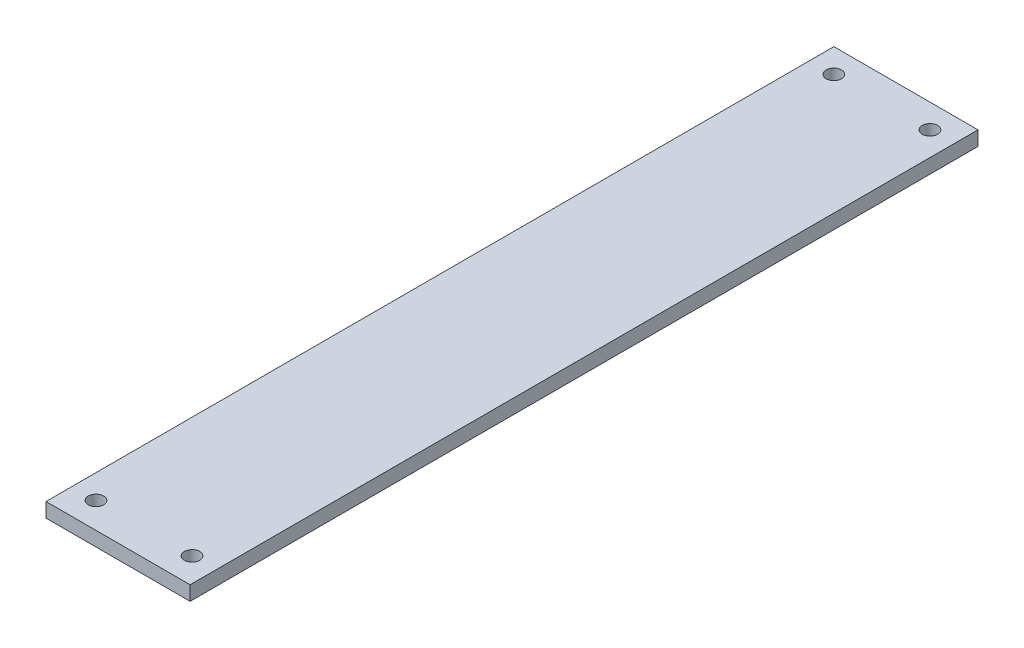
ISO-10303-21;
HEADER;
FILE_DESCRIPTION(('STEP AP214'),'2;1');
FILE_NAME('part.step','',(''),(''),'','','');
FILE_SCHEMA(('AUTOMOTIVE_DESIGN { 1 0 10303 214 1 1 1 1 }'));
ENDSEC;
DATA;
#1=APPLICATION_CONTEXT('core data for automotive mechanical design processes');
#2=APPLICATION_PROTOCOL_DEFINITION('international standard','automotive_design',2000,#1);
#3=PRODUCT_CONTEXT('',#1,'mechanical');
#4=PRODUCT('Part','Part','',(#3));
#5=PRODUCT_RELATED_PRODUCT_CATEGORY('part','',(#4));
#6=PRODUCT_DEFINITION_FORMATION('','',#4);
#7=PRODUCT_DEFINITION_CONTEXT('part definition',#1,'design');
#8=PRODUCT_DEFINITION('design','',#6,#7);
#9=PRODUCT_DEFINITION_SHAPE('','',#8);
#10=(LENGTH_UNIT() NAMED_UNIT(*) SI_UNIT(.MILLI.,.METRE.));
#11=(NAMED_UNIT(*) PLANE_ANGLE_UNIT() SI_UNIT($,.RADIAN.));
#12=(NAMED_UNIT(*) SI_UNIT($,.STERADIAN.) SOLID_ANGLE_UNIT());
#13=UNCERTAINTY_MEASURE_WITH_UNIT(LENGTH_MEASURE(1.E-05),#10,'distance_accuracy_value','');
#14=(GEOMETRIC_REPRESENTATION_CONTEXT(3) GLOBAL_UNCERTAINTY_ASSIGNED_CONTEXT((#13)) GLOBAL_UNIT_ASSIGNED_CONTEXT((#10,
#11,#12)) REPRESENTATION_CONTEXT('',''));
#15=CARTESIAN_POINT('',(0.,0.,0.));
#16=DIRECTION('',(0.,0.,1.));
#17=DIRECTION('',(1.,0.,0.));
#18=AXIS2_PLACEMENT_3D('',#15,#16,#17);
#19=CARTESIAN_POINT('',(0.,3.,0.));
#20=DIRECTION('',(1.,0.,0.));
#21=DIRECTION('',(0.,0.,-1.));
#22=AXIS2_PLACEMENT_3D('',#19,#20,#21);
#23=PLANE('',#22);
#24=DIRECTION('',(0.,0.,1.));
#25=VECTOR('',#24,1.);
#26=CARTESIAN_POINT('',(0.,0.,0.));
#27=LINE('',#26,#25);
#28=CARTESIAN_POINT('',(0.,0.,-164.));
#29=VERTEX_POINT('',#28);
#30=CARTESIAN_POINT('',(0.,0.,0.));
#31=VERTEX_POINT('',#30);
#32=EDGE_CURVE('E98',#29,#31,#27,.T.);
#33=ORIENTED_EDGE('',*,*,#32,.T.);
#34=DIRECTION('',(0.,-1.,0.));
#35=VECTOR('',#34,1.);
#36=CARTESIAN_POINT('',(0.,3.,0.));
#37=LINE('',#36,#35);
#38=CARTESIAN_POINT('',(0.,3.,0.));
#39=VERTEX_POINT('',#38);
#40=EDGE_CURVE('E11',#39,#31,#37,.T.);
#41=ORIENTED_EDGE('',*,*,#40,.F.);
#42=DIRECTION('',(0.,0.,1.));
#43=VECTOR('',#42,1.);
#44=CARTESIAN_POINT('',(0.,3.,0.));
#45=LINE('',#44,#43);
#46=CARTESIAN_POINT('',(0.,3.,-164.));
#47=VERTEX_POINT('',#46);
#48=EDGE_CURVE('E85',#47,#39,#45,.T.);
#49=ORIENTED_EDGE('',*,*,#48,.F.);
#50=DIRECTION('',(0.,-1.,0.));
#51=VECTOR('',#50,1.);
#52=CARTESIAN_POINT('',(0.,3.,-164.));
#53=LINE('',#52,#51);
#54=EDGE_CURVE('E94',#47,#29,#53,.T.);
#55=ORIENTED_EDGE('',*,*,#54,.T.);
#56=EDGE_LOOP('',(#33,#41,#49,#55));
#57=FACE_BOUND('',#56,.T.);
#58=ADVANCED_FACE('F32',(#57),#23,.F.);
#59=CARTESIAN_POINT('',(0.,3.,0.));
#60=DIRECTION('',(0.,0.,-1.));
#61=DIRECTION('',(-1.,0.,0.));
#62=AXIS2_PLACEMENT_3D('',#59,#60,#61);
#63=PLANE('',#62);
#64=DIRECTION('',(1.,0.,0.));
#65=VECTOR('',#64,1.);
#66=CARTESIAN_POINT('',(0.,0.,0.));
#67=LINE('',#66,#65);
#68=CARTESIAN_POINT('',(30.,0.,0.));
#69=VERTEX_POINT('',#68);
#70=EDGE_CURVE('E89',#31,#69,#67,.T.);
#71=ORIENTED_EDGE('',*,*,#70,.T.);
#72=DIRECTION('',(0.,-1.,0.));
#73=VECTOR('',#72,1.);
#74=CARTESIAN_POINT('',(30.,3.,0.));
#75=LINE('',#74,#73);
#76=CARTESIAN_POINT('',(30.,3.,0.));
#77=VERTEX_POINT('',#76);
#78=EDGE_CURVE('E41',#77,#69,#75,.T.);
#79=ORIENTED_EDGE('',*,*,#78,.F.);
#80=DIRECTION('',(1.,0.,0.));
#81=VECTOR('',#80,1.);
#82=CARTESIAN_POINT('',(0.,3.,0.));
#83=LINE('',#82,#81);
#84=EDGE_CURVE('E80',#39,#77,#83,.T.);
#85=ORIENTED_EDGE('',*,*,#84,.F.);
#86=ORIENTED_EDGE('',*,*,#40,.T.);
#87=EDGE_LOOP('',(#71,#79,#85,#86));
#88=FACE_BOUND('',#87,.T.);
#89=ADVANCED_FACE('F88',(#88),#63,.F.);
#90=CARTESIAN_POINT('',(30.,3.,0.));
#91=DIRECTION('',(-1.,0.,0.));
#92=DIRECTION('',(0.,0.,1.));
#93=AXIS2_PLACEMENT_3D('',#90,#91,#92);
#94=PLANE('',#93);
#95=DIRECTION('',(0.,0.,-1.));
#96=VECTOR('',#95,1.);
#97=CARTESIAN_POINT('',(30.,0.,0.));
#98=LINE('',#97,#96);
#99=CARTESIAN_POINT('',(30.,0.,-164.));
#100=VERTEX_POINT('',#99);
#101=EDGE_CURVE('E67',#69,#100,#98,.T.);
#102=ORIENTED_EDGE('',*,*,#101,.T.);
#103=DIRECTION('',(0.,-1.,0.));
#104=VECTOR('',#103,1.);
#105=CARTESIAN_POINT('',(30.,3.,-164.));
#106=LINE('',#105,#104);
#107=CARTESIAN_POINT('',(30.,3.,-164.));
#108=VERTEX_POINT('',#107);
#109=EDGE_CURVE('E90',#108,#100,#106,.T.);
#110=ORIENTED_EDGE('',*,*,#109,.F.);
#111=DIRECTION('',(0.,0.,-1.));
#112=VECTOR('',#111,1.);
#113=CARTESIAN_POINT('',(30.,3.,0.));
#114=LINE('',#113,#112);
#115=EDGE_CURVE('E83',#77,#108,#114,.T.);
#116=ORIENTED_EDGE('',*,*,#115,.F.);
#117=ORIENTED_EDGE('',*,*,#78,.T.);
#118=EDGE_LOOP('',(#102,#110,#116,#117));
#119=FACE_BOUND('',#118,.T.);
#120=ADVANCED_FACE('F92',(#119),#94,.F.);
#121=CARTESIAN_POINT('',(0.,3.,-164.));
#122=DIRECTION('',(0.,0.,1.));
#123=DIRECTION('',(1.,0.,0.));
#124=AXIS2_PLACEMENT_3D('',#121,#122,#123);
#125=PLANE('',#124);
#126=DIRECTION('',(-1.,0.,0.));
#127=VECTOR('',#126,1.);
#128=CARTESIAN_POINT('',(0.,0.,-164.));
#129=LINE('',#128,#127);
#130=EDGE_CURVE('E73',#100,#29,#129,.T.);
#131=ORIENTED_EDGE('',*,*,#130,.T.);
#132=ORIENTED_EDGE('',*,*,#54,.F.);
#133=DIRECTION('',(-1.,0.,0.));
#134=VECTOR('',#133,1.);
#135=CARTESIAN_POINT('',(0.,3.,-164.));
#136=LINE('',#135,#134);
#137=EDGE_CURVE('E50',#108,#47,#136,.T.);
#138=ORIENTED_EDGE('',*,*,#137,.F.);
#139=ORIENTED_EDGE('',*,*,#109,.T.);
#140=EDGE_LOOP('',(#131,#132,#138,#139));
#141=FACE_BOUND('',#140,.T.);
#142=ADVANCED_FACE('F134',(#141),#125,.F.);
#143=CARTESIAN_POINT('',(0.,3.,0.));
#144=DIRECTION('',(0.,-1.,0.));
#145=DIRECTION('',(0.,0.,-1.));
#146=AXIS2_PLACEMENT_3D('',#143,#144,#145);
#147=PLANE('',#146);
#148=CARTESIAN_POINT('',(25.,3.,-5.40000000000002));
#149=DIRECTION('',(0.,1.,0.));
#150=DIRECTION('',(0.,0.,1.));
#151=AXIS2_PLACEMENT_3D('',#148,#149,#150);
#152=CIRCLE('',#151,1.6);
#153=CARTESIAN_POINT('',(25.,3.,-3.80000000000001));
#154=VERTEX_POINT('',#153);
#155=EDGE_CURVE('E215',#154,#154,#152,.T.);
#156=ORIENTED_EDGE('',*,*,#155,.F.);
#157=EDGE_LOOP('',(#156));
#158=FACE_BOUND('',#157,.T.);
#159=CARTESIAN_POINT('',(5.,3.,-159.));
#160=DIRECTION('',(0.,1.,0.));
#161=DIRECTION('',(0.,0.,1.));
#162=AXIS2_PLACEMENT_3D('',#159,#160,#161);
#163=CIRCLE('',#162,1.59999999999999);
#164=CARTESIAN_POINT('',(5.,3.,-157.4));
#165=VERTEX_POINT('',#164);
#166=EDGE_CURVE('E213',#165,#165,#163,.T.);
#167=ORIENTED_EDGE('',*,*,#166,.F.);
#168=EDGE_LOOP('',(#167));
#169=FACE_BOUND('',#168,.T.);
#170=CARTESIAN_POINT('',(4.99999999999997,3.,-5.40000000000002));
#171=DIRECTION('',(0.,1.,0.));
#172=DIRECTION('',(0.,0.,1.));
#173=AXIS2_PLACEMENT_3D('',#170,#171,#172);
#174=CIRCLE('',#173,1.6);
#175=CARTESIAN_POINT('',(4.99999999999997,3.,-3.80000000000002));
#176=VERTEX_POINT('',#175);
#177=EDGE_CURVE('E216',#176,#176,#174,.T.);
#178=ORIENTED_EDGE('',*,*,#177,.F.);
#179=EDGE_LOOP('',(#178));
#180=FACE_BOUND('',#179,.T.);
#181=CARTESIAN_POINT('',(25.,3.,-159.));
#182=DIRECTION('',(0.,1.,0.));
#183=DIRECTION('',(0.,0.,1.));
#184=AXIS2_PLACEMENT_3D('',#181,#182,#183);
#185=CIRCLE('',#184,1.59999999999999);
#186=CARTESIAN_POINT('',(25.,3.,-157.4));
#187=VERTEX_POINT('',#186);
#188=EDGE_CURVE('E110',#187,#187,#185,.T.);
#189=ORIENTED_EDGE('',*,*,#188,.F.);
#190=EDGE_LOOP('',(#189));
#191=FACE_BOUND('',#190,.T.);
#192=ORIENTED_EDGE('',*,*,#48,.T.);
#193=ORIENTED_EDGE('',*,*,#84,.T.);
#194=ORIENTED_EDGE('',*,*,#115,.T.);
#195=ORIENTED_EDGE('',*,*,#137,.T.);
#196=EDGE_LOOP('',(#192,#193,#194,#195));
#197=FACE_BOUND('',#196,.T.);
#198=ADVANCED_FACE('F81',(#158,#169,#180,#191,#197),#147,.F.);
#199=CARTESIAN_POINT('',(0.,0.,0.));
#200=DIRECTION('',(0.,-1.,0.));
#201=DIRECTION('',(0.,0.,-1.));
#202=AXIS2_PLACEMENT_3D('',#199,#200,#201);
#203=PLANE('',#202);
#204=CARTESIAN_POINT('',(25.,0.,-5.40000000000002));
#205=DIRECTION('',(0.,-1.,0.));
#206=DIRECTION('',(0.,0.,-1.));
#207=AXIS2_PLACEMENT_3D('',#204,#205,#206);
#208=CIRCLE('',#207,1.6);
#209=CARTESIAN_POINT('',(25.,0.,-7.00000000000002));
#210=VERTEX_POINT('',#209);
#211=EDGE_CURVE('E35',#210,#210,#208,.T.);
#212=ORIENTED_EDGE('',*,*,#211,.F.);
#213=EDGE_LOOP('',(#212));
#214=FACE_BOUND('',#213,.T.);
#215=CARTESIAN_POINT('',(5.,0.,-159.));
#216=DIRECTION('',(0.,-1.,0.));
#217=DIRECTION('',(0.,0.,-1.));
#218=AXIS2_PLACEMENT_3D('',#215,#216,#217);
#219=CIRCLE('',#218,1.59999999999999);
#220=CARTESIAN_POINT('',(5.,0.,-160.6));
#221=VERTEX_POINT('',#220);
#222=EDGE_CURVE('E112',#221,#221,#219,.T.);
#223=ORIENTED_EDGE('',*,*,#222,.F.);
#224=EDGE_LOOP('',(#223));
#225=FACE_BOUND('',#224,.T.);
#226=CARTESIAN_POINT('',(4.99999999999997,0.,-5.40000000000002));
#227=DIRECTION('',(0.,-1.,0.));
#228=DIRECTION('',(0.,0.,-1.));
#229=AXIS2_PLACEMENT_3D('',#226,#227,#228);
#230=CIRCLE('',#229,1.6);
#231=CARTESIAN_POINT('',(4.99999999999997,0.,-7.00000000000002));
#232=VERTEX_POINT('',#231);
#233=EDGE_CURVE('E109',#232,#232,#230,.T.);
#234=ORIENTED_EDGE('',*,*,#233,.F.);
#235=EDGE_LOOP('',(#234));
#236=FACE_BOUND('',#235,.T.);
#237=CARTESIAN_POINT('',(25.,0.,-159.));
#238=DIRECTION('',(0.,-1.,0.));
#239=DIRECTION('',(0.,0.,-1.));
#240=AXIS2_PLACEMENT_3D('',#237,#238,#239);
#241=CIRCLE('',#240,1.59999999999999);
#242=CARTESIAN_POINT('',(25.,0.,-160.6));
#243=VERTEX_POINT('',#242);
#244=EDGE_CURVE('E106',#243,#243,#241,.T.);
#245=ORIENTED_EDGE('',*,*,#244,.F.);
#246=EDGE_LOOP('',(#245));
#247=FACE_BOUND('',#246,.T.);
#248=ORIENTED_EDGE('',*,*,#32,.F.);
#249=ORIENTED_EDGE('',*,*,#130,.F.);
#250=ORIENTED_EDGE('',*,*,#101,.F.);
#251=ORIENTED_EDGE('',*,*,#70,.F.);
#252=EDGE_LOOP('',(#248,#249,#250,#251));
#253=FACE_BOUND('',#252,.T.);
#254=ADVANCED_FACE('F122',(#214,#225,#236,#247,#253),#203,.T.);
#255=CARTESIAN_POINT('',(25.,-7.,-159.));
#256=DIRECTION('',(0.,1.,0.));
#257=DIRECTION('',(0.,0.,1.));
#258=AXIS2_PLACEMENT_3D('',#255,#256,#257);
#259=CYLINDRICAL_SURFACE('',#258,1.59999999999999);
#260=ORIENTED_EDGE('',*,*,#244,.T.);
#261=EDGE_LOOP('',(#260));
#262=FACE_BOUND('',#261,.T.);
#263=ORIENTED_EDGE('',*,*,#188,.T.);
#264=EDGE_LOOP('',(#263));
#265=FACE_BOUND('',#264,.T.);
#266=ADVANCED_FACE('F125',(#262,#265),#259,.F.);
#267=CARTESIAN_POINT('',(4.99999999999997,-7.,-5.40000000000002));
#268=DIRECTION('',(0.,1.,0.));
#269=DIRECTION('',(0.,0.,1.));
#270=AXIS2_PLACEMENT_3D('',#267,#268,#269);
#271=CYLINDRICAL_SURFACE('',#270,1.6);
#272=ORIENTED_EDGE('',*,*,#233,.T.);
#273=EDGE_LOOP('',(#272));
#274=FACE_BOUND('',#273,.T.);
#275=ORIENTED_EDGE('',*,*,#177,.T.);
#276=EDGE_LOOP('',(#275));
#277=FACE_BOUND('',#276,.T.);
#278=ADVANCED_FACE('F179',(#274,#277),#271,.F.);
#279=CARTESIAN_POINT('',(5.,-7.,-159.));
#280=DIRECTION('',(0.,1.,0.));
#281=DIRECTION('',(0.,0.,1.));
#282=AXIS2_PLACEMENT_3D('',#279,#280,#281);
#283=CYLINDRICAL_SURFACE('',#282,1.59999999999999);
#284=ORIENTED_EDGE('',*,*,#222,.T.);
#285=EDGE_LOOP('',(#284));
#286=FACE_BOUND('',#285,.T.);
#287=ORIENTED_EDGE('',*,*,#166,.T.);
#288=EDGE_LOOP('',(#287));
#289=FACE_BOUND('',#288,.T.);
#290=ADVANCED_FACE('F189',(#286,#289),#283,.F.);
#291=CARTESIAN_POINT('',(25.,-7.,-5.40000000000002));
#292=DIRECTION('',(0.,1.,0.));
#293=DIRECTION('',(0.,0.,1.));
#294=AXIS2_PLACEMENT_3D('',#291,#292,#293);
#295=CYLINDRICAL_SURFACE('',#294,1.6);
#296=ORIENTED_EDGE('',*,*,#211,.T.);
#297=EDGE_LOOP('',(#296));
#298=FACE_BOUND('',#297,.T.);
#299=ORIENTED_EDGE('',*,*,#155,.T.);
#300=EDGE_LOOP('',(#299));
#301=FACE_BOUND('',#300,.T.);
#302=ADVANCED_FACE('F119',(#298,#301),#295,.F.);
#303=CLOSED_SHELL('',(#58,#89,#120,#142,#198,#254,#266,#278,#290,#302));
#304=MANIFOLD_SOLID_BREP('B2',#303);
#305=ADVANCED_BREP_SHAPE_REPRESENTATION('',(#18,#304),#14);
#306=SHAPE_DEFINITION_REPRESENTATION(#9,#305);
ENDSEC;
END-ISO-10303-21;
